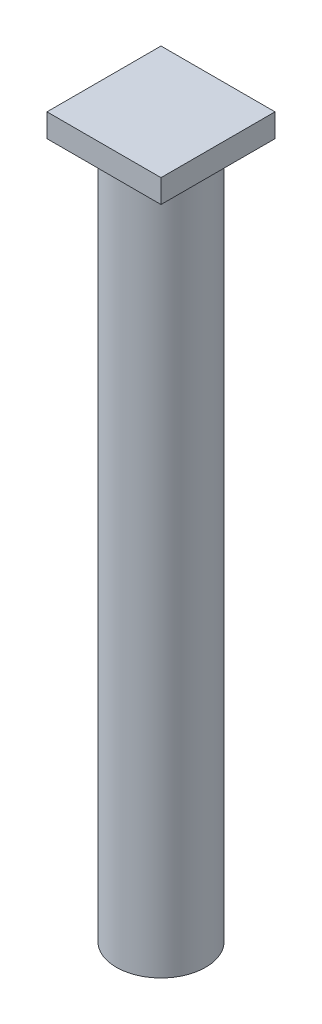
ISO-10303-21;
HEADER;
FILE_DESCRIPTION(('STEP AP214'),'2;1');
FILE_NAME('part.step','',(''),(''),'','','');
FILE_SCHEMA(('AUTOMOTIVE_DESIGN { 1 0 10303 214 1 1 1 1 }'));
ENDSEC;
DATA;
#1=APPLICATION_CONTEXT('core data for automotive mechanical design processes');
#2=APPLICATION_PROTOCOL_DEFINITION('international standard','automotive_design',2000,#1);
#3=PRODUCT_CONTEXT('',#1,'mechanical');
#4=PRODUCT('Part','Part','',(#3));
#5=PRODUCT_RELATED_PRODUCT_CATEGORY('part','',(#4));
#6=PRODUCT_DEFINITION_FORMATION('','',#4);
#7=PRODUCT_DEFINITION_CONTEXT('part definition',#1,'design');
#8=PRODUCT_DEFINITION('design','',#6,#7);
#9=PRODUCT_DEFINITION_SHAPE('','',#8);
#10=(LENGTH_UNIT() NAMED_UNIT(*) SI_UNIT(.MILLI.,.METRE.));
#11=(NAMED_UNIT(*) PLANE_ANGLE_UNIT() SI_UNIT($,.RADIAN.));
#12=(NAMED_UNIT(*) SI_UNIT($,.STERADIAN.) SOLID_ANGLE_UNIT());
#13=UNCERTAINTY_MEASURE_WITH_UNIT(LENGTH_MEASURE(1.E-05),#10,'distance_accuracy_value','');
#14=(GEOMETRIC_REPRESENTATION_CONTEXT(3) GLOBAL_UNCERTAINTY_ASSIGNED_CONTEXT((#13)) GLOBAL_UNIT_ASSIGNED_CONTEXT((#10,
#11,#12)) REPRESENTATION_CONTEXT('',''));
#15=CARTESIAN_POINT('',(0.,0.,0.));
#16=DIRECTION('',(0.,0.,1.));
#17=DIRECTION('',(1.,0.,0.));
#18=AXIS2_PLACEMENT_3D('',#15,#16,#17);
#19=CARTESIAN_POINT('',(0.,129.6797,0.));
#20=DIRECTION('',(0.,1.,0.));
#21=DIRECTION('',(0.,0.,1.));
#22=AXIS2_PLACEMENT_3D('',#19,#20,#21);
#23=PLANE('',#22);
#24=DIRECTION('',(-1.,0.,0.));
#25=VECTOR('',#24,1.);
#26=CARTESIAN_POINT('',(10.287,129.6797,-10.287));
#27=LINE('',#26,#25);
#28=CARTESIAN_POINT('',(-10.287,129.6797,-10.287));
#29=VERTEX_POINT('',#28);
#30=CARTESIAN_POINT('',(10.287,129.6797,-10.287));
#31=VERTEX_POINT('',#30);
#32=EDGE_CURVE('E60',#29,#31,#27,.F.);
#33=ORIENTED_EDGE('',*,*,#32,.F.);
#34=DIRECTION('',(0.,0.,1.));
#35=VECTOR('',#34,1.);
#36=CARTESIAN_POINT('',(-10.287,129.6797,-10.287));
#37=LINE('',#36,#35);
#38=CARTESIAN_POINT('',(-10.287,129.6797,10.287));
#39=VERTEX_POINT('',#38);
#40=EDGE_CURVE('E57',#39,#29,#37,.F.);
#41=ORIENTED_EDGE('',*,*,#40,.F.);
#42=DIRECTION('',(1.,0.,0.));
#43=VECTOR('',#42,1.);
#44=CARTESIAN_POINT('',(-10.287,129.6797,10.287));
#45=LINE('',#44,#43);
#46=CARTESIAN_POINT('',(10.287,129.6797,10.287));
#47=VERTEX_POINT('',#46);
#48=EDGE_CURVE('E54',#47,#39,#45,.F.);
#49=ORIENTED_EDGE('',*,*,#48,.F.);
#50=DIRECTION('',(0.,0.,-1.));
#51=VECTOR('',#50,1.);
#52=CARTESIAN_POINT('',(10.287,129.6797,10.287));
#53=LINE('',#52,#51);
#54=EDGE_CURVE('E71',#31,#47,#53,.F.);
#55=ORIENTED_EDGE('',*,*,#54,.F.);
#56=EDGE_LOOP('',(#33,#41,#49,#55));
#57=FACE_BOUND('',#56,.T.);
#58=ADVANCED_FACE('F17',(#57),#23,.T.);
#59=CARTESIAN_POINT('',(-10.287,125.476,-10.287));
#60=DIRECTION('',(-1.,0.,0.));
#61=DIRECTION('',(0.,0.,1.));
#62=AXIS2_PLACEMENT_3D('',#59,#60,#61);
#63=PLANE('',#62);
#64=DIRECTION('',(0.,1.,0.));
#65=VECTOR('',#64,1.);
#66=CARTESIAN_POINT('',(-10.287,125.476,-10.287));
#67=LINE('',#66,#65);
#68=CARTESIAN_POINT('',(-10.287,125.476,-10.287));
#69=VERTEX_POINT('',#68);
#70=EDGE_CURVE('E80',#69,#29,#67,.T.);
#71=ORIENTED_EDGE('',*,*,#70,.F.);
#72=DIRECTION('',(0.,0.,1.));
#73=VECTOR('',#72,1.);
#74=CARTESIAN_POINT('',(-10.287,125.476,0.));
#75=LINE('',#74,#73);
#76=CARTESIAN_POINT('',(-10.287,125.476,10.287));
#77=VERTEX_POINT('',#76);
#78=EDGE_CURVE('E68',#69,#77,#75,.T.);
#79=ORIENTED_EDGE('',*,*,#78,.T.);
#80=DIRECTION('',(0.,1.,0.));
#81=VECTOR('',#80,1.);
#82=CARTESIAN_POINT('',(-10.287,125.476,10.287));
#83=LINE('',#82,#81);
#84=EDGE_CURVE('E65',#39,#77,#83,.F.);
#85=ORIENTED_EDGE('',*,*,#84,.F.);
#86=ORIENTED_EDGE('',*,*,#40,.T.);
#87=EDGE_LOOP('',(#71,#79,#85,#86));
#88=FACE_BOUND('',#87,.T.);
#89=ADVANCED_FACE('F66',(#88),#63,.T.);
#90=CARTESIAN_POINT('',(-10.287,125.476,10.287));
#91=DIRECTION('',(0.,0.,1.));
#92=DIRECTION('',(1.,0.,0.));
#93=AXIS2_PLACEMENT_3D('',#90,#91,#92);
#94=PLANE('',#93);
#95=ORIENTED_EDGE('',*,*,#84,.T.);
#96=DIRECTION('',(1.,0.,0.));
#97=VECTOR('',#96,1.);
#98=CARTESIAN_POINT('',(0.,125.476,10.287));
#99=LINE('',#98,#97);
#100=CARTESIAN_POINT('',(10.287,125.476,10.287));
#101=VERTEX_POINT('',#100);
#102=EDGE_CURVE('E86',#77,#101,#99,.T.);
#103=ORIENTED_EDGE('',*,*,#102,.T.);
#104=DIRECTION('',(0.,1.,0.));
#105=VECTOR('',#104,1.);
#106=CARTESIAN_POINT('',(10.287,125.476,10.287));
#107=LINE('',#106,#105);
#108=EDGE_CURVE('E74',#47,#101,#107,.F.);
#109=ORIENTED_EDGE('',*,*,#108,.F.);
#110=ORIENTED_EDGE('',*,*,#48,.T.);
#111=EDGE_LOOP('',(#95,#103,#109,#110));
#112=FACE_BOUND('',#111,.T.);
#113=ADVANCED_FACE('F73',(#112),#94,.T.);
#114=CARTESIAN_POINT('',(10.287,125.476,10.287));
#115=DIRECTION('',(1.,0.,0.));
#116=DIRECTION('',(0.,0.,-1.));
#117=AXIS2_PLACEMENT_3D('',#114,#115,#116);
#118=PLANE('',#117);
#119=ORIENTED_EDGE('',*,*,#108,.T.);
#120=DIRECTION('',(0.,0.,1.));
#121=VECTOR('',#120,1.);
#122=CARTESIAN_POINT('',(10.287,125.476,0.));
#123=LINE('',#122,#121);
#124=CARTESIAN_POINT('',(10.287,125.476,-10.287));
#125=VERTEX_POINT('',#124);
#126=EDGE_CURVE('E33',#101,#125,#123,.F.);
#127=ORIENTED_EDGE('',*,*,#126,.T.);
#128=DIRECTION('',(0.,1.,0.));
#129=VECTOR('',#128,1.);
#130=CARTESIAN_POINT('',(10.287,125.476,-10.287));
#131=LINE('',#130,#129);
#132=EDGE_CURVE('E83',#31,#125,#131,.F.);
#133=ORIENTED_EDGE('',*,*,#132,.F.);
#134=ORIENTED_EDGE('',*,*,#54,.T.);
#135=EDGE_LOOP('',(#119,#127,#133,#134));
#136=FACE_BOUND('',#135,.T.);
#137=ADVANCED_FACE('F111',(#136),#118,.T.);
#138=CARTESIAN_POINT('',(10.287,125.476,-10.287));
#139=DIRECTION('',(0.,0.,-1.));
#140=DIRECTION('',(-1.,0.,0.));
#141=AXIS2_PLACEMENT_3D('',#138,#139,#140);
#142=PLANE('',#141);
#143=ORIENTED_EDGE('',*,*,#132,.T.);
#144=DIRECTION('',(1.,0.,0.));
#145=VECTOR('',#144,1.);
#146=CARTESIAN_POINT('',(0.,125.476,-10.287));
#147=LINE('',#146,#145);
#148=EDGE_CURVE('E89',#125,#69,#147,.F.);
#149=ORIENTED_EDGE('',*,*,#148,.T.);
#150=ORIENTED_EDGE('',*,*,#70,.T.);
#151=ORIENTED_EDGE('',*,*,#32,.T.);
#152=EDGE_LOOP('',(#143,#149,#150,#151));
#153=FACE_BOUND('',#152,.T.);
#154=ADVANCED_FACE('F102',(#153),#142,.T.);
#155=CARTESIAN_POINT('',(0.,0.,0.));
#156=DIRECTION('',(0.,1.,0.));
#157=DIRECTION('',(0.,0.,1.));
#158=AXIS2_PLACEMENT_3D('',#155,#156,#157);
#159=PLANE('',#158);
#160=CARTESIAN_POINT('',(0.,0.,0.));
#161=DIRECTION('',(0.,1.,0.));
#162=DIRECTION('',(0.,0.,1.));
#163=AXIS2_PLACEMENT_3D('',#160,#161,#162);
#164=CIRCLE('',#163,8.05815);
#165=CARTESIAN_POINT('',(0.,0.,8.05815));
#166=VERTEX_POINT('',#165);
#167=EDGE_CURVE('E20',#166,#166,#164,.T.);
#168=ORIENTED_EDGE('',*,*,#167,.F.);
#169=EDGE_LOOP('',(#168));
#170=FACE_BOUND('',#169,.T.);
#171=ADVANCED_FACE('F99',(#170),#159,.F.);
#172=CARTESIAN_POINT('',(0.,125.476,0.));
#173=DIRECTION('',(0.,1.,0.));
#174=DIRECTION('',(0.,0.,1.));
#175=AXIS2_PLACEMENT_3D('',#172,#173,#174);
#176=PLANE('',#175);
#177=CARTESIAN_POINT('',(0.,125.476,0.));
#178=DIRECTION('',(0.,1.,0.));
#179=DIRECTION('',(0.,0.,1.));
#180=AXIS2_PLACEMENT_3D('',#177,#178,#179);
#181=CIRCLE('',#180,8.05815);
#182=CARTESIAN_POINT('',(0.,125.476,8.05815));
#183=VERTEX_POINT('',#182);
#184=EDGE_CURVE('E11',#183,#183,#181,.F.);
#185=ORIENTED_EDGE('',*,*,#184,.F.);
#186=EDGE_LOOP('',(#185));
#187=FACE_BOUND('',#186,.T.);
#188=ORIENTED_EDGE('',*,*,#126,.F.);
#189=ORIENTED_EDGE('',*,*,#102,.F.);
#190=ORIENTED_EDGE('',*,*,#78,.F.);
#191=ORIENTED_EDGE('',*,*,#148,.F.);
#192=EDGE_LOOP('',(#188,#189,#190,#191));
#193=FACE_BOUND('',#192,.T.);
#194=ADVANCED_FACE('F101',(#187,#193),#176,.F.);
#195=CARTESIAN_POINT('',(0.,0.,0.));
#196=DIRECTION('',(0.,1.,0.));
#197=DIRECTION('',(0.,0.,1.));
#198=AXIS2_PLACEMENT_3D('',#195,#196,#197);
#199=CYLINDRICAL_SURFACE('',#198,8.05815);
#200=ORIENTED_EDGE('',*,*,#167,.T.);
#201=EDGE_LOOP('',(#200));
#202=FACE_BOUND('',#201,.T.);
#203=ORIENTED_EDGE('',*,*,#184,.T.);
#204=EDGE_LOOP('',(#203));
#205=FACE_BOUND('',#204,.T.);
#206=ADVANCED_FACE('F96',(#202,#205),#199,.T.);
#207=CLOSED_SHELL('',(#58,#89,#113,#137,#154,#171,#194,#206));
#208=MANIFOLD_SOLID_BREP('B1',#207);
#209=ADVANCED_BREP_SHAPE_REPRESENTATION('',(#18,#208),#14);
#210=SHAPE_DEFINITION_REPRESENTATION(#9,#209);
ENDSEC;
END-ISO-10303-21;
